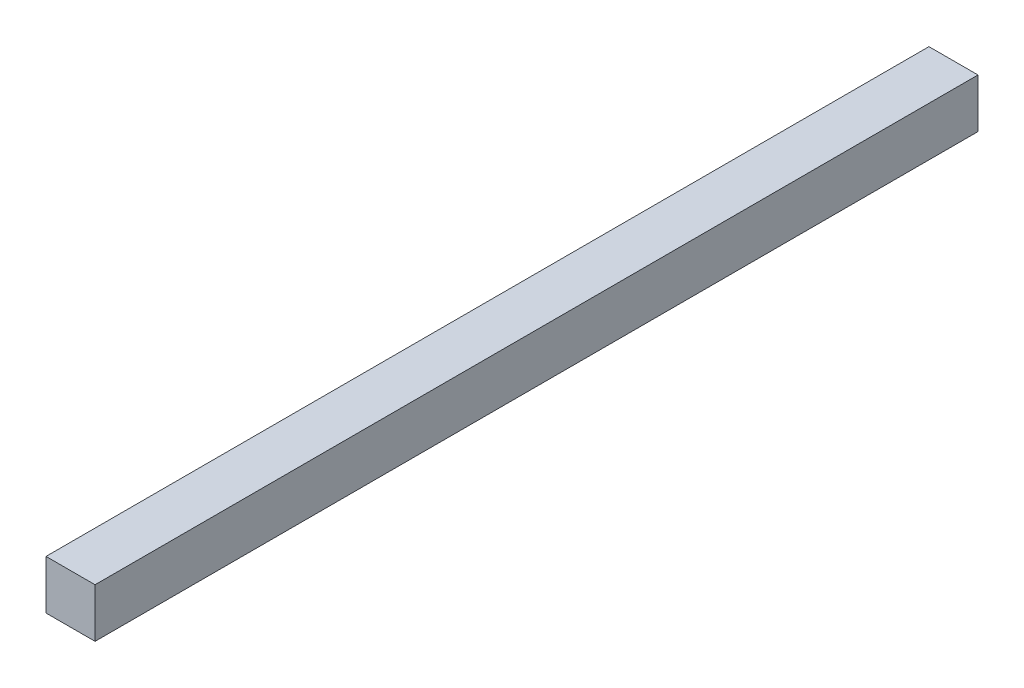
ISO-10303-21;
HEADER;
FILE_DESCRIPTION(('STEP AP214'),'2;1');
FILE_NAME('part.step','',(''),(''),'','','');
FILE_SCHEMA(('AUTOMOTIVE_DESIGN { 1 0 10303 214 1 1 1 1 }'));
ENDSEC;
DATA;
#1=APPLICATION_CONTEXT('core data for automotive mechanical design processes');
#2=APPLICATION_PROTOCOL_DEFINITION('international standard','automotive_design',2000,#1);
#3=PRODUCT_CONTEXT('',#1,'mechanical');
#4=PRODUCT('Part','Part','',(#3));
#5=PRODUCT_RELATED_PRODUCT_CATEGORY('part','',(#4));
#6=PRODUCT_DEFINITION_FORMATION('','',#4);
#7=PRODUCT_DEFINITION_CONTEXT('part definition',#1,'design');
#8=PRODUCT_DEFINITION('design','',#6,#7);
#9=PRODUCT_DEFINITION_SHAPE('','',#8);
#10=(LENGTH_UNIT() NAMED_UNIT(*) SI_UNIT(.MILLI.,.METRE.));
#11=(NAMED_UNIT(*) PLANE_ANGLE_UNIT() SI_UNIT($,.RADIAN.));
#12=(NAMED_UNIT(*) SI_UNIT($,.STERADIAN.) SOLID_ANGLE_UNIT());
#13=UNCERTAINTY_MEASURE_WITH_UNIT(LENGTH_MEASURE(1.E-05),#10,'distance_accuracy_value','');
#14=(GEOMETRIC_REPRESENTATION_CONTEXT(3) GLOBAL_UNCERTAINTY_ASSIGNED_CONTEXT((#13)) GLOBAL_UNIT_ASSIGNED_CONTEXT((#10,
#11,#12)) REPRESENTATION_CONTEXT('',''));
#15=CARTESIAN_POINT('',(0.,0.,0.));
#16=DIRECTION('',(0.,0.,1.));
#17=DIRECTION('',(1.,0.,0.));
#18=AXIS2_PLACEMENT_3D('',#15,#16,#17);
#19=CARTESIAN_POINT('',(0.,0.,457.2));
#20=DIRECTION('',(1.,0.,0.));
#21=DIRECTION('',(0.,1.,0.));
#22=AXIS2_PLACEMENT_3D('',#19,#20,#21);
#23=PLANE('',#22);
#24=DIRECTION('',(0.,-1.,0.));
#25=VECTOR('',#24,1.);
#26=CARTESIAN_POINT('',(0.,0.,0.));
#27=LINE('',#26,#25);
#28=CARTESIAN_POINT('',(0.,0.,0.));
#29=VERTEX_POINT('',#28);
#30=CARTESIAN_POINT('',(0.,-25.4,0.));
#31=VERTEX_POINT('',#30);
#32=EDGE_CURVE('E95',#29,#31,#27,.T.);
#33=ORIENTED_EDGE('',*,*,#32,.T.);
#34=DIRECTION('',(0.,0.,-1.));
#35=VECTOR('',#34,1.);
#36=CARTESIAN_POINT('',(0.,-25.4,457.2));
#37=LINE('',#36,#35);
#38=CARTESIAN_POINT('',(0.,-25.4,457.2));
#39=VERTEX_POINT('',#38);
#40=EDGE_CURVE('E11',#39,#31,#37,.T.);
#41=ORIENTED_EDGE('',*,*,#40,.F.);
#42=DIRECTION('',(0.,-1.,0.));
#43=VECTOR('',#42,1.);
#44=CARTESIAN_POINT('',(0.,0.,457.2));
#45=LINE('',#44,#43);
#46=CARTESIAN_POINT('',(0.,0.,457.2));
#47=VERTEX_POINT('',#46);
#48=EDGE_CURVE('E81',#47,#39,#45,.T.);
#49=ORIENTED_EDGE('',*,*,#48,.F.);
#50=DIRECTION('',(0.,0.,-1.));
#51=VECTOR('',#50,1.);
#52=CARTESIAN_POINT('',(0.,0.,457.2));
#53=LINE('',#52,#51);
#54=EDGE_CURVE('E48',#47,#29,#53,.T.);
#55=ORIENTED_EDGE('',*,*,#54,.T.);
#56=EDGE_LOOP('',(#33,#41,#49,#55));
#57=FACE_BOUND('',#56,.T.);
#58=ADVANCED_FACE('F32',(#57),#23,.F.);
#59=CARTESIAN_POINT('',(0.,-25.4,457.2));
#60=DIRECTION('',(0.,1.,0.));
#61=DIRECTION('',(0.,0.,1.));
#62=AXIS2_PLACEMENT_3D('',#59,#60,#61);
#63=PLANE('',#62);
#64=DIRECTION('',(1.,0.,0.));
#65=VECTOR('',#64,1.);
#66=CARTESIAN_POINT('',(0.,-25.4,0.));
#67=LINE('',#66,#65);
#68=CARTESIAN_POINT('',(25.4,-25.4,0.));
#69=VERTEX_POINT('',#68);
#70=EDGE_CURVE('E86',#31,#69,#67,.T.);
#71=ORIENTED_EDGE('',*,*,#70,.T.);
#72=DIRECTION('',(0.,0.,-1.));
#73=VECTOR('',#72,1.);
#74=CARTESIAN_POINT('',(25.4,-25.4,457.2));
#75=LINE('',#74,#73);
#76=CARTESIAN_POINT('',(25.4,-25.4,457.2));
#77=VERTEX_POINT('',#76);
#78=EDGE_CURVE('E40',#77,#69,#75,.T.);
#79=ORIENTED_EDGE('',*,*,#78,.F.);
#80=DIRECTION('',(1.,0.,0.));
#81=VECTOR('',#80,1.);
#82=CARTESIAN_POINT('',(0.,-25.4,457.2));
#83=LINE('',#82,#81);
#84=EDGE_CURVE('E73',#39,#77,#83,.T.);
#85=ORIENTED_EDGE('',*,*,#84,.F.);
#86=ORIENTED_EDGE('',*,*,#40,.T.);
#87=EDGE_LOOP('',(#71,#79,#85,#86));
#88=FACE_BOUND('',#87,.T.);
#89=ADVANCED_FACE('F85',(#88),#63,.F.);
#90=CARTESIAN_POINT('',(25.4,0.,457.2));
#91=DIRECTION('',(1.,0.,0.));
#92=DIRECTION('',(0.,1.,0.));
#93=AXIS2_PLACEMENT_3D('',#90,#91,#92);
#94=PLANE('',#93);
#95=DIRECTION('',(0.,-1.,0.));
#96=VECTOR('',#95,1.);
#97=CARTESIAN_POINT('',(25.4,0.,0.));
#98=LINE('',#97,#96);
#99=CARTESIAN_POINT('',(25.4,0.,0.));
#100=VERTEX_POINT('',#99);
#101=EDGE_CURVE('E98',#100,#69,#98,.T.);
#102=ORIENTED_EDGE('',*,*,#101,.F.);
#103=DIRECTION('',(0.,0.,-1.));
#104=VECTOR('',#103,1.);
#105=CARTESIAN_POINT('',(25.4,0.,457.2));
#106=LINE('',#105,#104);
#107=CARTESIAN_POINT('',(25.4,0.,457.2));
#108=VERTEX_POINT('',#107);
#109=EDGE_CURVE('E62',#108,#100,#106,.T.);
#110=ORIENTED_EDGE('',*,*,#109,.F.);
#111=DIRECTION('',(0.,-1.,0.));
#112=VECTOR('',#111,1.);
#113=CARTESIAN_POINT('',(25.4,0.,457.2));
#114=LINE('',#113,#112);
#115=EDGE_CURVE('E80',#108,#77,#114,.T.);
#116=ORIENTED_EDGE('',*,*,#115,.T.);
#117=ORIENTED_EDGE('',*,*,#78,.T.);
#118=EDGE_LOOP('',(#102,#110,#116,#117));
#119=FACE_BOUND('',#118,.T.);
#120=ADVANCED_FACE('F89',(#119),#94,.T.);
#121=CARTESIAN_POINT('',(0.,0.,457.2));
#122=DIRECTION('',(0.,1.,0.));
#123=DIRECTION('',(0.,0.,1.));
#124=AXIS2_PLACEMENT_3D('',#121,#122,#123);
#125=PLANE('',#124);
#126=DIRECTION('',(1.,0.,0.));
#127=VECTOR('',#126,1.);
#128=CARTESIAN_POINT('',(0.,0.,0.));
#129=LINE('',#128,#127);
#130=EDGE_CURVE('E100',#29,#100,#129,.T.);
#131=ORIENTED_EDGE('',*,*,#130,.F.);
#132=ORIENTED_EDGE('',*,*,#54,.F.);
#133=DIRECTION('',(1.,0.,0.));
#134=VECTOR('',#133,1.);
#135=CARTESIAN_POINT('',(0.,0.,457.2));
#136=LINE('',#135,#134);
#137=EDGE_CURVE('E90',#47,#108,#136,.T.);
#138=ORIENTED_EDGE('',*,*,#137,.T.);
#139=ORIENTED_EDGE('',*,*,#109,.T.);
#140=EDGE_LOOP('',(#131,#132,#138,#139));
#141=FACE_BOUND('',#140,.T.);
#142=ADVANCED_FACE('F106',(#141),#125,.T.);
#143=CARTESIAN_POINT('',(0.,0.,457.2));
#144=DIRECTION('',(0.,0.,1.));
#145=DIRECTION('',(1.,0.,0.));
#146=AXIS2_PLACEMENT_3D('',#143,#144,#145);
#147=PLANE('',#146);
#148=ORIENTED_EDGE('',*,*,#48,.T.);
#149=ORIENTED_EDGE('',*,*,#84,.T.);
#150=ORIENTED_EDGE('',*,*,#115,.F.);
#151=ORIENTED_EDGE('',*,*,#137,.F.);
#152=EDGE_LOOP('',(#148,#149,#150,#151));
#153=FACE_BOUND('',#152,.T.);
#154=ADVANCED_FACE('F77',(#153),#147,.T.);
#155=CARTESIAN_POINT('',(0.,0.,0.));
#156=DIRECTION('',(0.,0.,1.));
#157=DIRECTION('',(1.,0.,0.));
#158=AXIS2_PLACEMENT_3D('',#155,#156,#157);
#159=PLANE('',#158);
#160=ORIENTED_EDGE('',*,*,#32,.F.);
#161=ORIENTED_EDGE('',*,*,#130,.T.);
#162=ORIENTED_EDGE('',*,*,#101,.T.);
#163=ORIENTED_EDGE('',*,*,#70,.F.);
#164=EDGE_LOOP('',(#160,#161,#162,#163));
#165=FACE_BOUND('',#164,.T.);
#166=ADVANCED_FACE('F105',(#165),#159,.F.);
#167=CLOSED_SHELL('',(#58,#89,#120,#142,#154,#166));
#168=MANIFOLD_SOLID_BREP('B2',#167);
#169=ADVANCED_BREP_SHAPE_REPRESENTATION('',(#18,#168),#14);
#170=SHAPE_DEFINITION_REPRESENTATION(#9,#169);
ENDSEC;
END-ISO-10303-21;
